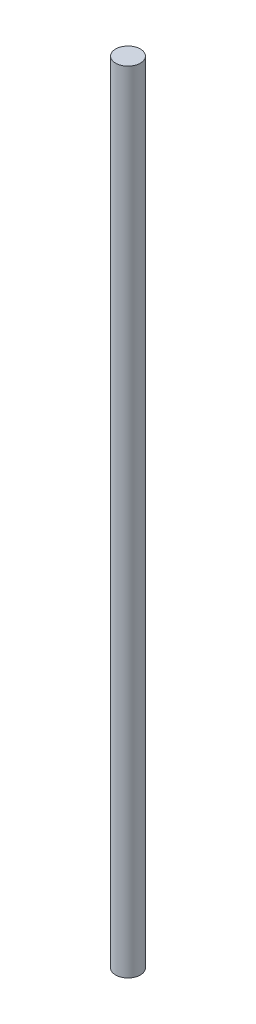
ISO-10303-21;
HEADER;
FILE_DESCRIPTION(('STEP AP214'),'2;1');
FILE_NAME('part.step','',(''),(''),'','','');
FILE_SCHEMA(('AUTOMOTIVE_DESIGN { 1 0 10303 214 1 1 1 1 }'));
ENDSEC;
DATA;
#1=APPLICATION_CONTEXT('core data for automotive mechanical design processes');
#2=APPLICATION_PROTOCOL_DEFINITION('international standard','automotive_design',2000,#1);
#3=PRODUCT_CONTEXT('',#1,'mechanical');
#4=PRODUCT('Part','Part','',(#3));
#5=PRODUCT_RELATED_PRODUCT_CATEGORY('part','',(#4));
#6=PRODUCT_DEFINITION_FORMATION('','',#4);
#7=PRODUCT_DEFINITION_CONTEXT('part definition',#1,'design');
#8=PRODUCT_DEFINITION('design','',#6,#7);
#9=PRODUCT_DEFINITION_SHAPE('','',#8);
#10=(LENGTH_UNIT() NAMED_UNIT(*) SI_UNIT(.MILLI.,.METRE.));
#11=(NAMED_UNIT(*) PLANE_ANGLE_UNIT() SI_UNIT($,.RADIAN.));
#12=(NAMED_UNIT(*) SI_UNIT($,.STERADIAN.) SOLID_ANGLE_UNIT());
#13=UNCERTAINTY_MEASURE_WITH_UNIT(LENGTH_MEASURE(1.E-05),#10,'distance_accuracy_value','');
#14=(GEOMETRIC_REPRESENTATION_CONTEXT(3) GLOBAL_UNCERTAINTY_ASSIGNED_CONTEXT((#13)) GLOBAL_UNIT_ASSIGNED_CONTEXT((#10,
#11,#12)) REPRESENTATION_CONTEXT('',''));
#15=CARTESIAN_POINT('',(0.,0.,0.));
#16=DIRECTION('',(0.,0.,1.));
#17=DIRECTION('',(1.,0.,0.));
#18=AXIS2_PLACEMENT_3D('',#15,#16,#17);
#19=CARTESIAN_POINT('',(0.,32.,0.));
#20=DIRECTION('',(0.,-1.,0.));
#21=DIRECTION('',(0.,0.,-1.));
#22=AXIS2_PLACEMENT_3D('',#19,#20,#21);
#23=CYLINDRICAL_SURFACE('',#22,0.5);
#24=CARTESIAN_POINT('',(0.,32.,0.));
#25=DIRECTION('',(0.,1.,0.));
#26=DIRECTION('',(0.,0.,1.));
#27=AXIS2_PLACEMENT_3D('',#24,#25,#26);
#28=CIRCLE('',#27,0.5);
#29=CARTESIAN_POINT('',(0.,32.,0.5));
#30=VERTEX_POINT('',#29);
#31=EDGE_CURVE('E10',#30,#30,#28,.T.);
#32=ORIENTED_EDGE('',*,*,#31,.F.);
#33=EDGE_LOOP('',(#32));
#34=FACE_BOUND('',#33,.T.);
#35=CARTESIAN_POINT('',(0.,0.,0.));
#36=DIRECTION('',(0.,1.,0.));
#37=DIRECTION('',(0.,0.,1.));
#38=AXIS2_PLACEMENT_3D('',#35,#36,#37);
#39=CIRCLE('',#38,0.5);
#40=CARTESIAN_POINT('',(0.,0.,0.5));
#41=VERTEX_POINT('',#40);
#42=EDGE_CURVE('E33',#41,#41,#39,.T.);
#43=ORIENTED_EDGE('',*,*,#42,.T.);
#44=EDGE_LOOP('',(#43));
#45=FACE_BOUND('',#44,.T.);
#46=ADVANCED_FACE('F30',(#34,#45),#23,.T.);
#47=CARTESIAN_POINT('',(0.,32.,0.));
#48=DIRECTION('',(0.,1.,0.));
#49=DIRECTION('',(0.,0.,1.));
#50=AXIS2_PLACEMENT_3D('',#47,#48,#49);
#51=PLANE('',#50);
#52=ORIENTED_EDGE('',*,*,#31,.T.);
#53=EDGE_LOOP('',(#52));
#54=FACE_BOUND('',#53,.T.);
#55=ADVANCED_FACE('F45',(#54),#51,.T.);
#56=CARTESIAN_POINT('',(0.,0.,0.));
#57=DIRECTION('',(0.,1.,0.));
#58=DIRECTION('',(0.,0.,1.));
#59=AXIS2_PLACEMENT_3D('',#56,#57,#58);
#60=PLANE('',#59);
#61=ORIENTED_EDGE('',*,*,#42,.F.);
#62=EDGE_LOOP('',(#61));
#63=FACE_BOUND('',#62,.T.);
#64=ADVANCED_FACE('F43',(#63),#60,.F.);
#65=CLOSED_SHELL('',(#46,#55,#64));
#66=MANIFOLD_SOLID_BREP('B2',#65);
#67=ADVANCED_BREP_SHAPE_REPRESENTATION('',(#18,#66),#14);
#68=SHAPE_DEFINITION_REPRESENTATION(#9,#67);
ENDSEC;
END-ISO-10303-21;
